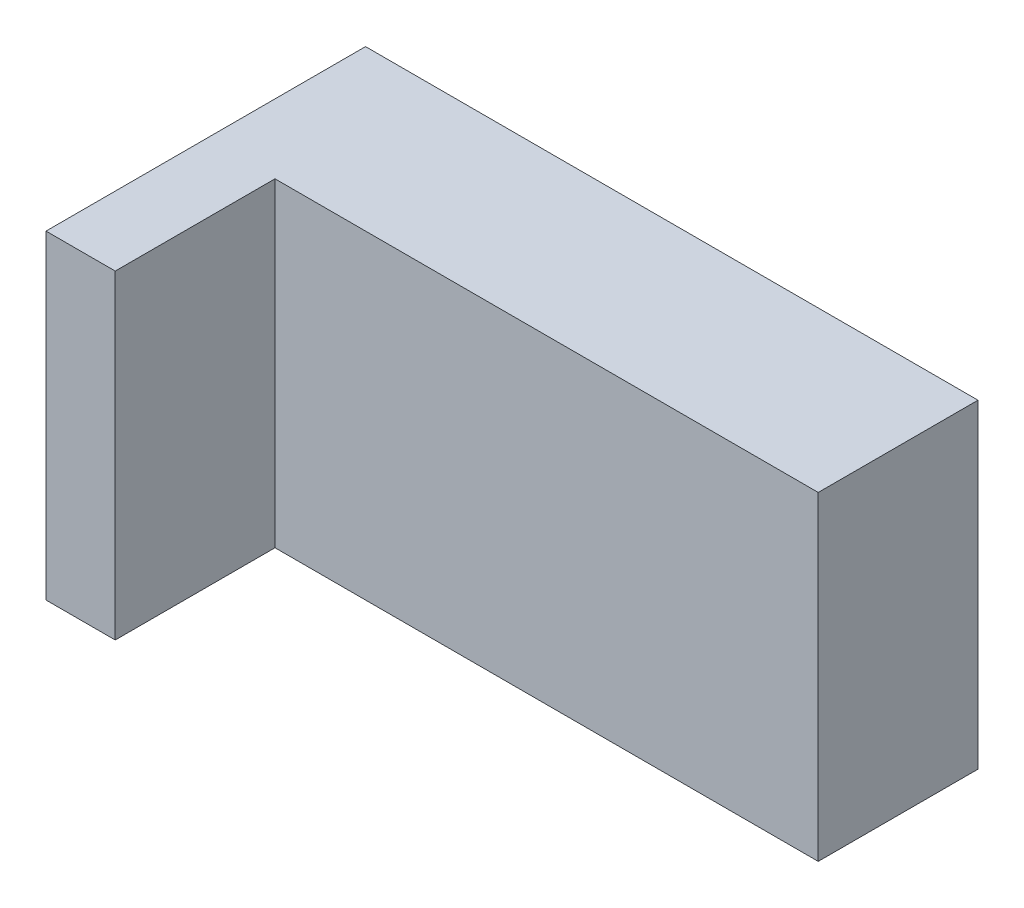
ISO-10303-21;
HEADER;
FILE_DESCRIPTION(('STEP AP214'),'2;1');
FILE_NAME('part.step','',(''),(''),'','','');
FILE_SCHEMA(('AUTOMOTIVE_DESIGN { 1 0 10303 214 1 1 1 1 }'));
ENDSEC;
DATA;
#1=APPLICATION_CONTEXT('core data for automotive mechanical design processes');
#2=APPLICATION_PROTOCOL_DEFINITION('international standard','automotive_design',2000,#1);
#3=PRODUCT_CONTEXT('',#1,'mechanical');
#4=PRODUCT('Part','Part','',(#3));
#5=PRODUCT_RELATED_PRODUCT_CATEGORY('part','',(#4));
#6=PRODUCT_DEFINITION_FORMATION('','',#4);
#7=PRODUCT_DEFINITION_CONTEXT('part definition',#1,'design');
#8=PRODUCT_DEFINITION('design','',#6,#7);
#9=PRODUCT_DEFINITION_SHAPE('','',#8);
#10=(LENGTH_UNIT() NAMED_UNIT(*) SI_UNIT(.MILLI.,.METRE.));
#11=(NAMED_UNIT(*) PLANE_ANGLE_UNIT() SI_UNIT($,.RADIAN.));
#12=(NAMED_UNIT(*) SI_UNIT($,.STERADIAN.) SOLID_ANGLE_UNIT());
#13=UNCERTAINTY_MEASURE_WITH_UNIT(LENGTH_MEASURE(1.E-05),#10,'distance_accuracy_value','');
#14=(GEOMETRIC_REPRESENTATION_CONTEXT(3) GLOBAL_UNCERTAINTY_ASSIGNED_CONTEXT((#13)) GLOBAL_UNIT_ASSIGNED_CONTEXT((#10,
#11,#12)) REPRESENTATION_CONTEXT('',''));
#15=CARTESIAN_POINT('',(0.,0.,0.));
#16=DIRECTION('',(0.,0.,1.));
#17=DIRECTION('',(1.,0.,0.));
#18=AXIS2_PLACEMENT_3D('',#15,#16,#17);
#19=CARTESIAN_POINT('',(115.,60.,60.));
#20=DIRECTION('',(-1.,0.,0.));
#21=DIRECTION('',(0.,-1.,0.));
#22=AXIS2_PLACEMENT_3D('',#19,#20,#21);
#23=PLANE('',#22);
#24=DIRECTION('',(0.,1.,0.));
#25=VECTOR('',#24,1.);
#26=CARTESIAN_POINT('',(115.,60.,0.));
#27=LINE('',#26,#25);
#28=CARTESIAN_POINT('',(115.,-60.,0.));
#29=VERTEX_POINT('',#28);
#30=CARTESIAN_POINT('',(115.,60.,0.));
#31=VERTEX_POINT('',#30);
#32=EDGE_CURVE('E97',#29,#31,#27,.T.);
#33=ORIENTED_EDGE('',*,*,#32,.T.);
#34=DIRECTION('',(0.,0.,-1.));
#35=VECTOR('',#34,1.);
#36=CARTESIAN_POINT('',(115.,60.,60.));
#37=LINE('',#36,#35);
#38=CARTESIAN_POINT('',(115.,60.,60.));
#39=VERTEX_POINT('',#38);
#40=EDGE_CURVE('E11',#39,#31,#37,.T.);
#41=ORIENTED_EDGE('',*,*,#40,.F.);
#42=DIRECTION('',(0.,1.,0.));
#43=VECTOR('',#42,1.);
#44=CARTESIAN_POINT('',(115.,60.,60.));
#45=LINE('',#44,#43);
#46=CARTESIAN_POINT('',(115.,-60.,60.));
#47=VERTEX_POINT('',#46);
#48=EDGE_CURVE('E91',#47,#39,#45,.T.);
#49=ORIENTED_EDGE('',*,*,#48,.F.);
#50=DIRECTION('',(0.,0.,-1.));
#51=VECTOR('',#50,1.);
#52=CARTESIAN_POINT('',(115.,-60.,60.));
#53=LINE('',#52,#51);
#54=EDGE_CURVE('E82',#47,#29,#53,.T.);
#55=ORIENTED_EDGE('',*,*,#54,.T.);
#56=EDGE_LOOP('',(#33,#41,#49,#55));
#57=FACE_BOUND('',#56,.T.);
#58=ADVANCED_FACE('F39',(#57),#23,.F.);
#59=CARTESIAN_POINT('',(-115.,60.,60.));
#60=DIRECTION('',(0.,-1.,0.));
#61=DIRECTION('',(0.,0.,-1.));
#62=AXIS2_PLACEMENT_3D('',#59,#60,#61);
#63=PLANE('',#62);
#64=DIRECTION('',(-1.,0.,0.));
#65=VECTOR('',#64,1.);
#66=CARTESIAN_POINT('',(-115.,60.,0.));
#67=LINE('',#66,#65);
#68=CARTESIAN_POINT('',(-115.,60.,0.));
#69=VERTEX_POINT('',#68);
#70=EDGE_CURVE('E101',#31,#69,#67,.T.);
#71=ORIENTED_EDGE('',*,*,#70,.T.);
#72=DIRECTION('',(0.,0.,-1.));
#73=VECTOR('',#72,1.);
#74=CARTESIAN_POINT('',(-115.,60.,60.));
#75=LINE('',#74,#73);
#76=CARTESIAN_POINT('',(-115.,60.,120.));
#77=VERTEX_POINT('',#76);
#78=EDGE_CURVE('E47',#77,#69,#75,.T.);
#79=ORIENTED_EDGE('',*,*,#78,.F.);
#80=DIRECTION('',(-1.,0.,0.));
#81=VECTOR('',#80,1.);
#82=CARTESIAN_POINT('',(-115.,60.,120.));
#83=LINE('',#82,#81);
#84=CARTESIAN_POINT('',(-89.0000000000001,60.,120.));
#85=VERTEX_POINT('',#84);
#86=EDGE_CURVE('E131',#85,#77,#83,.T.);
#87=ORIENTED_EDGE('',*,*,#86,.F.);
#88=DIRECTION('',(0.,0.,-1.));
#89=VECTOR('',#88,1.);
#90=CARTESIAN_POINT('',(-89.0000000000001,60.,120.));
#91=LINE('',#90,#89);
#92=CARTESIAN_POINT('',(-89.0000000000001,60.,60.));
#93=VERTEX_POINT('',#92);
#94=EDGE_CURVE('E109',#85,#93,#91,.T.);
#95=ORIENTED_EDGE('',*,*,#94,.T.);
#96=DIRECTION('',(-1.,0.,0.));
#97=VECTOR('',#96,1.);
#98=CARTESIAN_POINT('',(-115.,60.,60.));
#99=LINE('',#98,#97);
#100=EDGE_CURVE('E153',#39,#93,#99,.T.);
#101=ORIENTED_EDGE('',*,*,#100,.F.);
#102=ORIENTED_EDGE('',*,*,#40,.T.);
#103=EDGE_LOOP('',(#71,#79,#87,#95,#101,#102));
#104=FACE_BOUND('',#103,.T.);
#105=ADVANCED_FACE('F128',(#104),#63,.F.);
#106=CARTESIAN_POINT('',(-115.,60.,60.));
#107=DIRECTION('',(1.,0.,0.));
#108=DIRECTION('',(0.,1.,0.));
#109=AXIS2_PLACEMENT_3D('',#106,#107,#108);
#110=PLANE('',#109);
#111=DIRECTION('',(0.,-1.,0.));
#112=VECTOR('',#111,1.);
#113=CARTESIAN_POINT('',(-115.,60.,0.));
#114=LINE('',#113,#112);
#115=CARTESIAN_POINT('',(-115.,-60.,0.));
#116=VERTEX_POINT('',#115);
#117=EDGE_CURVE('E92',#69,#116,#114,.T.);
#118=ORIENTED_EDGE('',*,*,#117,.T.);
#119=DIRECTION('',(0.,0.,-1.));
#120=VECTOR('',#119,1.);
#121=CARTESIAN_POINT('',(-115.,-60.,60.));
#122=LINE('',#121,#120);
#123=CARTESIAN_POINT('',(-115.,-60.,120.));
#124=VERTEX_POINT('',#123);
#125=EDGE_CURVE('E86',#124,#116,#122,.T.);
#126=ORIENTED_EDGE('',*,*,#125,.F.);
#127=DIRECTION('',(0.,-1.,0.));
#128=VECTOR('',#127,1.);
#129=CARTESIAN_POINT('',(-115.,60.,120.));
#130=LINE('',#129,#128);
#131=EDGE_CURVE('E124',#77,#124,#130,.T.);
#132=ORIENTED_EDGE('',*,*,#131,.F.);
#133=ORIENTED_EDGE('',*,*,#78,.T.);
#134=EDGE_LOOP('',(#118,#126,#132,#133));
#135=FACE_BOUND('',#134,.T.);
#136=ADVANCED_FACE('F122',(#135),#110,.F.);
#137=CARTESIAN_POINT('',(-115.,-60.,60.));
#138=DIRECTION('',(0.,1.,0.));
#139=DIRECTION('',(0.,0.,1.));
#140=AXIS2_PLACEMENT_3D('',#137,#138,#139);
#141=PLANE('',#140);
#142=DIRECTION('',(1.,0.,0.));
#143=VECTOR('',#142,1.);
#144=CARTESIAN_POINT('',(-115.,-60.,0.));
#145=LINE('',#144,#143);
#146=EDGE_CURVE('E79',#116,#29,#145,.T.);
#147=ORIENTED_EDGE('',*,*,#146,.T.);
#148=ORIENTED_EDGE('',*,*,#54,.F.);
#149=DIRECTION('',(1.,0.,0.));
#150=VECTOR('',#149,1.);
#151=CARTESIAN_POINT('',(-115.,-60.,60.));
#152=LINE('',#151,#150);
#153=CARTESIAN_POINT('',(-89.0000000000001,-60.,60.));
#154=VERTEX_POINT('',#153);
#155=EDGE_CURVE('E59',#154,#47,#152,.T.);
#156=ORIENTED_EDGE('',*,*,#155,.F.);
#157=DIRECTION('',(0.,0.,-1.));
#158=VECTOR('',#157,1.);
#159=CARTESIAN_POINT('',(-89.,-60.,120.));
#160=LINE('',#159,#158);
#161=CARTESIAN_POINT('',(-89.,-60.,120.));
#162=VERTEX_POINT('',#161);
#163=EDGE_CURVE('E103',#162,#154,#160,.T.);
#164=ORIENTED_EDGE('',*,*,#163,.F.);
#165=DIRECTION('',(1.,0.,0.));
#166=VECTOR('',#165,1.);
#167=CARTESIAN_POINT('',(-115.,-60.,120.));
#168=LINE('',#167,#166);
#169=EDGE_CURVE('E146',#124,#162,#168,.T.);
#170=ORIENTED_EDGE('',*,*,#169,.F.);
#171=ORIENTED_EDGE('',*,*,#125,.T.);
#172=EDGE_LOOP('',(#147,#148,#156,#164,#170,#171));
#173=FACE_BOUND('',#172,.T.);
#174=ADVANCED_FACE('F81',(#173),#141,.F.);
#175=CARTESIAN_POINT('',(0.,0.,60.));
#176=DIRECTION('',(0.,0.,1.));
#177=DIRECTION('',(1.,0.,0.));
#178=AXIS2_PLACEMENT_3D('',#175,#176,#177);
#179=PLANE('',#178);
#180=DIRECTION('',(0.,1.,0.));
#181=VECTOR('',#180,1.);
#182=CARTESIAN_POINT('',(-89.0000000000001,60.,60.));
#183=LINE('',#182,#181);
#184=EDGE_CURVE('E54',#154,#93,#183,.T.);
#185=ORIENTED_EDGE('',*,*,#184,.F.);
#186=ORIENTED_EDGE('',*,*,#155,.T.);
#187=ORIENTED_EDGE('',*,*,#48,.T.);
#188=ORIENTED_EDGE('',*,*,#100,.T.);
#189=EDGE_LOOP('',(#185,#186,#187,#188));
#190=FACE_BOUND('',#189,.T.);
#191=ADVANCED_FACE('F157',(#190),#179,.T.);
#192=CARTESIAN_POINT('',(0.,0.,0.));
#193=DIRECTION('',(0.,0.,1.));
#194=DIRECTION('',(1.,0.,0.));
#195=AXIS2_PLACEMENT_3D('',#192,#193,#194);
#196=PLANE('',#195);
#197=ORIENTED_EDGE('',*,*,#32,.F.);
#198=ORIENTED_EDGE('',*,*,#146,.F.);
#199=ORIENTED_EDGE('',*,*,#117,.F.);
#200=ORIENTED_EDGE('',*,*,#70,.F.);
#201=EDGE_LOOP('',(#197,#198,#199,#200));
#202=FACE_BOUND('',#201,.T.);
#203=ADVANCED_FACE('F100',(#202),#196,.F.);
#204=CARTESIAN_POINT('',(-89.0000000000001,60.,120.));
#205=DIRECTION('',(-1.,0.,0.));
#206=DIRECTION('',(0.,-1.,0.));
#207=AXIS2_PLACEMENT_3D('',#204,#205,#206);
#208=PLANE('',#207);
#209=ORIENTED_EDGE('',*,*,#184,.T.);
#210=ORIENTED_EDGE('',*,*,#94,.F.);
#211=DIRECTION('',(0.,1.,0.));
#212=VECTOR('',#211,1.);
#213=CARTESIAN_POINT('',(-89.0000000000001,60.,120.));
#214=LINE('',#213,#212);
#215=EDGE_CURVE('E139',#162,#85,#214,.T.);
#216=ORIENTED_EDGE('',*,*,#215,.F.);
#217=ORIENTED_EDGE('',*,*,#163,.T.);
#218=EDGE_LOOP('',(#209,#210,#216,#217));
#219=FACE_BOUND('',#218,.T.);
#220=ADVANCED_FACE('F159',(#219),#208,.F.);
#221=CARTESIAN_POINT('',(0.,0.,120.));
#222=DIRECTION('',(0.,0.,1.));
#223=DIRECTION('',(1.,0.,0.));
#224=AXIS2_PLACEMENT_3D('',#221,#222,#223);
#225=PLANE('',#224);
#226=ORIENTED_EDGE('',*,*,#131,.T.);
#227=ORIENTED_EDGE('',*,*,#169,.T.);
#228=ORIENTED_EDGE('',*,*,#215,.T.);
#229=ORIENTED_EDGE('',*,*,#86,.T.);
#230=EDGE_LOOP('',(#226,#227,#228,#229));
#231=FACE_BOUND('',#230,.T.);
#232=ADVANCED_FACE('F135',(#231),#225,.T.);
#233=CLOSED_SHELL('',(#58,#105,#136,#174,#191,#203,#220,#232));
#234=MANIFOLD_SOLID_BREP('B2',#233);
#235=ADVANCED_BREP_SHAPE_REPRESENTATION('',(#18,#234),#14);
#236=SHAPE_DEFINITION_REPRESENTATION(#9,#235);
ENDSEC;
END-ISO-10303-21;
